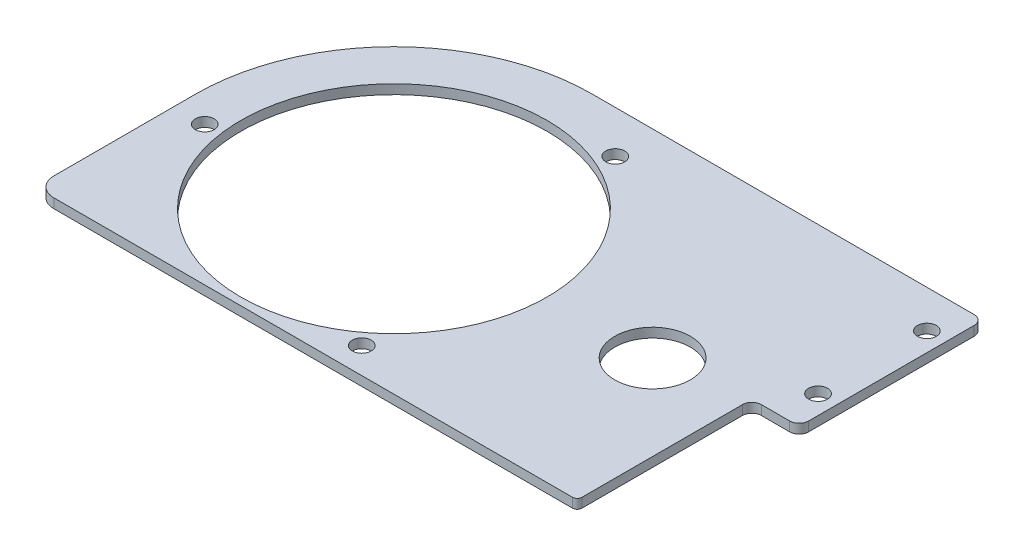
ISO-10303-21;
HEADER;
FILE_DESCRIPTION(('STEP AP214'),'2;1');
FILE_NAME('part.step','',(''),(''),'','','');
FILE_SCHEMA(('AUTOMOTIVE_DESIGN { 1 0 10303 214 1 1 1 1 }'));
ENDSEC;
DATA;
#1=APPLICATION_CONTEXT('core data for automotive mechanical design processes');
#2=APPLICATION_PROTOCOL_DEFINITION('international standard','automotive_design',2000,#1);
#3=PRODUCT_CONTEXT('',#1,'mechanical');
#4=PRODUCT('Part','Part','',(#3));
#5=PRODUCT_RELATED_PRODUCT_CATEGORY('part','',(#4));
#6=PRODUCT_DEFINITION_FORMATION('','',#4);
#7=PRODUCT_DEFINITION_CONTEXT('part definition',#1,'design');
#8=PRODUCT_DEFINITION('design','',#6,#7);
#9=PRODUCT_DEFINITION_SHAPE('','',#8);
#10=(LENGTH_UNIT() NAMED_UNIT(*) SI_UNIT(.MILLI.,.METRE.));
#11=(NAMED_UNIT(*) PLANE_ANGLE_UNIT() SI_UNIT($,.RADIAN.));
#12=(NAMED_UNIT(*) SI_UNIT($,.STERADIAN.) SOLID_ANGLE_UNIT());
#13=UNCERTAINTY_MEASURE_WITH_UNIT(LENGTH_MEASURE(1.E-05),#10,'distance_accuracy_value','');
#14=(GEOMETRIC_REPRESENTATION_CONTEXT(3) GLOBAL_UNCERTAINTY_ASSIGNED_CONTEXT((#13)) GLOBAL_UNIT_ASSIGNED_CONTEXT((#10,
#11,#12)) REPRESENTATION_CONTEXT('',''));
#15=CARTESIAN_POINT('',(0.,0.,0.));
#16=DIRECTION('',(0.,0.,1.));
#17=DIRECTION('',(1.,0.,0.));
#18=AXIS2_PLACEMENT_3D('',#15,#16,#17);
#19=CARTESIAN_POINT('',(-120.668920929197,6.35,95.2310790708027));
#20=DIRECTION('',(0.,-1.,0.));
#21=DIRECTION('',(0.,0.,-1.));
#22=AXIS2_PLACEMENT_3D('',#19,#20,#21);
#23=PLANE('',#22);
#24=CARTESIAN_POINT('',(-120.668920929197,6.35,95.2310790708027));
#25=DIRECTION('',(0.,1.,0.));
#26=DIRECTION('',(0.,0.,-1.));
#27=AXIS2_PLACEMENT_3D('',#24,#25,#26);
#28=CIRCLE('',#27,12.7);
#29=CARTESIAN_POINT('',(-133.368920929197,6.35,95.2310790708027));
#30=VERTEX_POINT('',#29);
#31=CARTESIAN_POINT('',(-120.668920929197,6.35,107.931079070803));
#32=VERTEX_POINT('',#31);
#33=EDGE_CURVE('E179',#30,#32,#28,.T.);
#34=ORIENTED_EDGE('',*,*,#33,.T.);
#35=DIRECTION('',(1.,0.,0.));
#36=VECTOR('',#35,1.);
#37=CARTESIAN_POINT('',(227.955539535401,6.35,107.931079070803));
#38=LINE('',#37,#36);
#39=CARTESIAN_POINT('',(227.955539535401,6.35,107.931079070803));
#40=VERTEX_POINT('',#39);
#41=EDGE_CURVE('E107',#32,#40,#38,.T.);
#42=ORIENTED_EDGE('',*,*,#41,.T.);
#43=CARTESIAN_POINT('',(227.955539535401,6.35,104.765539535401));
#44=DIRECTION('',(0.,1.,0.));
#45=DIRECTION('',(0.,0.,1.));
#46=AXIS2_PLACEMENT_3D('',#43,#44,#45);
#47=CIRCLE('',#46,3.16553953540139);
#48=CARTESIAN_POINT('',(231.121079070803,6.35,104.765539535401));
#49=VERTEX_POINT('',#48);
#50=EDGE_CURVE('E206',#40,#49,#47,.T.);
#51=ORIENTED_EDGE('',*,*,#50,.T.);
#52=DIRECTION('',(0.,0.,-1.));
#53=VECTOR('',#52,1.);
#54=CARTESIAN_POINT('',(231.121079070803,6.35,104.765539535401));
#55=LINE('',#54,#53);
#56=CARTESIAN_POINT('',(231.121079070803,6.35,-3.1007771089668));
#57=VERTEX_POINT('',#56);
#58=EDGE_CURVE('E225',#49,#57,#55,.T.);
#59=ORIENTED_EDGE('',*,*,#58,.T.);
#60=CARTESIAN_POINT('',(237.471079070803,6.35,-3.1007771089668));
#61=DIRECTION('',(0.,-1.,0.));
#62=DIRECTION('',(0.,0.,1.));
#63=AXIS2_PLACEMENT_3D('',#60,#61,#62);
#64=CIRCLE('',#63,6.35);
#65=CARTESIAN_POINT('',(237.471079070803,6.35,-9.4507771089668));
#66=VERTEX_POINT('',#65);
#67=EDGE_CURVE('E222',#57,#66,#64,.T.);
#68=ORIENTED_EDGE('',*,*,#67,.T.);
#69=DIRECTION('',(1.,0.,0.));
#70=VECTOR('',#69,1.);
#71=CARTESIAN_POINT('',(237.471079070803,6.35,-9.4507771089668));
#72=LINE('',#71,#70);
#73=CARTESIAN_POINT('',(256.521079070803,6.35,-9.4507771089668));
#74=VERTEX_POINT('',#73);
#75=EDGE_CURVE('E224',#66,#74,#72,.T.);
#76=ORIENTED_EDGE('',*,*,#75,.T.);
#77=CARTESIAN_POINT('',(256.521079070803,6.35,-15.8007771089668));
#78=DIRECTION('',(0.,1.,0.));
#79=DIRECTION('',(0.,0.,-1.));
#80=AXIS2_PLACEMENT_3D('',#77,#78,#79);
#81=CIRCLE('',#80,6.35000000000001);
#82=CARTESIAN_POINT('',(262.871079070803,6.35,-15.8007771089668));
#83=VERTEX_POINT('',#82);
#84=EDGE_CURVE('E227',#74,#83,#81,.T.);
#85=ORIENTED_EDGE('',*,*,#84,.T.);
#86=DIRECTION('',(0.,0.,-1.));
#87=VECTOR('',#86,1.);
#88=CARTESIAN_POINT('',(262.871079070803,6.35,-127.018920929198));
#89=LINE('',#88,#87);
#90=CARTESIAN_POINT('',(262.871079070803,6.35,-127.018920929198));
#91=VERTEX_POINT('',#90);
#92=EDGE_CURVE('E233',#83,#91,#89,.T.);
#93=ORIENTED_EDGE('',*,*,#92,.T.);
#94=CARTESIAN_POINT('',(256.521079070803,6.35,-127.018920929198));
#95=DIRECTION('',(0.,1.,0.));
#96=DIRECTION('',(0.,0.,-1.));
#97=AXIS2_PLACEMENT_3D('',#94,#95,#96);
#98=CIRCLE('',#97,6.34999999999997);
#99=CARTESIAN_POINT('',(256.521079070803,6.35,-133.368920929197));
#100=VERTEX_POINT('',#99);
#101=EDGE_CURVE('E138',#91,#100,#98,.T.);
#102=ORIENTED_EDGE('',*,*,#101,.T.);
#103=DIRECTION('',(-1.,0.,0.));
#104=VECTOR('',#103,1.);
#105=CARTESIAN_POINT('',(256.521079070803,6.35,-133.368920929197));
#106=LINE('',#105,#104);
#107=CARTESIAN_POINT('',(0.,6.35,-133.368920929197));
#108=VERTEX_POINT('',#107);
#109=EDGE_CURVE('E132',#100,#108,#106,.T.);
#110=ORIENTED_EDGE('',*,*,#109,.T.);
#111=CARTESIAN_POINT('',(0.,6.35,0.));
#112=DIRECTION('',(0.,1.,0.));
#113=DIRECTION('',(0.,0.,-1.));
#114=AXIS2_PLACEMENT_3D('',#111,#112,#113);
#115=CIRCLE('',#114,133.368920929197);
#116=CARTESIAN_POINT('',(-133.368920929197,6.35,0.));
#117=VERTEX_POINT('',#116);
#118=EDGE_CURVE('E136',#108,#117,#115,.T.);
#119=ORIENTED_EDGE('',*,*,#118,.T.);
#120=DIRECTION('',(0.,0.,1.));
#121=VECTOR('',#120,1.);
#122=CARTESIAN_POINT('',(-133.368920929197,6.35,0.));
#123=LINE('',#122,#121);
#124=EDGE_CURVE('E52',#117,#30,#123,.T.);
#125=ORIENTED_EDGE('',*,*,#124,.T.);
#126=EDGE_LOOP('',(#34,#42,#51,#59,#68,#76,#85,#93,#102,#110,#119,#125));
#127=FACE_BOUND('',#126,.T.);
#128=CARTESIAN_POINT('',(0.,6.35,0.));
#129=DIRECTION('',(0.,1.,0.));
#130=DIRECTION('',(0.,0.,1.));
#131=AXIS2_PLACEMENT_3D('',#128,#129,#130);
#132=CIRCLE('',#131,102.87);
#133=CARTESIAN_POINT('',(0.,6.35,102.87));
#134=VERTEX_POINT('',#133);
#135=EDGE_CURVE('E160',#134,#134,#132,.T.);
#136=ORIENTED_EDGE('',*,*,#135,.F.);
#137=EDGE_LOOP('',(#136));
#138=FACE_BOUND('',#137,.T.);
#139=CARTESIAN_POINT('',(-112.738641363336,6.35,14.3749635436919));
#140=DIRECTION('',(0.,1.,0.));
#141=DIRECTION('',(0.,0.,1.));
#142=AXIS2_PLACEMENT_3D('',#139,#140,#141);
#143=CIRCLE('',#142,6.34999999998776);
#144=CARTESIAN_POINT('',(-112.738641363336,6.35,20.7249635436796));
#145=VERTEX_POINT('',#144);
#146=EDGE_CURVE('E327',#145,#145,#143,.T.);
#147=ORIENTED_EDGE('',*,*,#146,.F.);
#148=EDGE_LOOP('',(#147));
#149=FACE_BOUND('',#148,.T.);
#150=CARTESIAN_POINT('',(250.171079070803,6.35,-107.968920929197));
#151=DIRECTION('',(0.,1.,0.));
#152=DIRECTION('',(0.,0.,1.));
#153=AXIS2_PLACEMENT_3D('',#150,#151,#152);
#154=CIRCLE('',#153,6.34999999999999);
#155=CARTESIAN_POINT('',(250.171079070803,6.35,-101.618920929198));
#156=VERTEX_POINT('',#155);
#157=EDGE_CURVE('E321',#156,#156,#154,.T.);
#158=ORIENTED_EDGE('',*,*,#157,.F.);
#159=EDGE_LOOP('',(#158));
#160=FACE_BOUND('',#159,.T.);
#161=CARTESIAN_POINT('',(250.171079070803,6.35,-34.8507771089668));
#162=DIRECTION('',(0.,1.,0.));
#163=DIRECTION('',(0.,0.,1.));
#164=AXIS2_PLACEMENT_3D('',#161,#162,#163);
#165=CIRCLE('',#164,6.34999999999993);
#166=CARTESIAN_POINT('',(250.171079070803,6.35,-28.5007771089669));
#167=VERTEX_POINT('',#166);
#168=EDGE_CURVE('E315',#167,#167,#165,.T.);
#169=ORIENTED_EDGE('',*,*,#168,.F.);
#170=EDGE_LOOP('',(#169));
#171=FACE_BOUND('',#170,.T.);
#172=CARTESIAN_POINT('',(43.9202370743555,6.35,-104.822009180638));
#173=DIRECTION('',(0.,1.,0.));
#174=DIRECTION('',(0.,0.,1.));
#175=AXIS2_PLACEMENT_3D('',#172,#173,#174);
#176=CIRCLE('',#175,6.35000000000721);
#177=CARTESIAN_POINT('',(43.9202370743555,6.35,-98.4720091806306));
#178=VERTEX_POINT('',#177);
#179=EDGE_CURVE('E309',#178,#178,#176,.T.);
#180=ORIENTED_EDGE('',*,*,#179,.F.);
#181=EDGE_LOOP('',(#180));
#182=FACE_BOUND('',#181,.T.);
#183=CARTESIAN_POINT('',(68.8184042889803,6.35,90.4470456369459));
#184=DIRECTION('',(0.,1.,0.));
#185=DIRECTION('',(0.,0.,1.));
#186=AXIS2_PLACEMENT_3D('',#183,#184,#185);
#187=CIRCLE('',#186,6.35000000000499);
#188=CARTESIAN_POINT('',(68.8184042889803,6.35,96.7970456369509));
#189=VERTEX_POINT('',#188);
#190=EDGE_CURVE('E302',#189,#189,#187,.T.);
#191=ORIENTED_EDGE('',*,*,#190,.F.);
#192=EDGE_LOOP('',(#191));
#193=FACE_BOUND('',#192,.T.);
#194=CARTESIAN_POINT('',(173.810939205606,6.35,0.));
#195=DIRECTION('',(0.,-1.,0.));
#196=DIRECTION('',(0.,0.,-1.));
#197=AXIS2_PLACEMENT_3D('',#194,#195,#196);
#198=CIRCLE('',#197,25.4);
#199=CARTESIAN_POINT('',(173.810939205606,6.35,-25.4));
#200=VERTEX_POINT('',#199);
#201=EDGE_CURVE('E297',#200,#200,#198,.F.);
#202=ORIENTED_EDGE('',*,*,#201,.F.);
#203=EDGE_LOOP('',(#202));
#204=FACE_BOUND('',#203,.T.);
#205=ADVANCED_FACE('F35',(#127,#138,#149,#160,#171,#182,#193,#204),#23,.F.);
#206=CARTESIAN_POINT('',(-120.668920929197,0.,95.2310790708027));
#207=DIRECTION('',(0.,-1.,0.));
#208=DIRECTION('',(0.,0.,-1.));
#209=AXIS2_PLACEMENT_3D('',#206,#207,#208);
#210=PLANE('',#209);
#211=CARTESIAN_POINT('',(68.8184042889803,0.,90.4470456369459));
#212=DIRECTION('',(0.,1.,0.));
#213=DIRECTION('',(0.,0.,1.));
#214=AXIS2_PLACEMENT_3D('',#211,#212,#213);
#215=CIRCLE('',#214,6.35000000000499);
#216=CARTESIAN_POINT('',(68.8184042889803,0.,96.7970456369509));
#217=VERTEX_POINT('',#216);
#218=EDGE_CURVE('E299',#217,#217,#215,.T.);
#219=ORIENTED_EDGE('',*,*,#218,.T.);
#220=EDGE_LOOP('',(#219));
#221=FACE_BOUND('',#220,.T.);
#222=CARTESIAN_POINT('',(250.171079070803,0.,-34.8507771089668));
#223=DIRECTION('',(0.,1.,0.));
#224=DIRECTION('',(0.,0.,1.));
#225=AXIS2_PLACEMENT_3D('',#222,#223,#224);
#226=CIRCLE('',#225,6.34999999999993);
#227=CARTESIAN_POINT('',(250.171079070803,0.,-28.5007771089669));
#228=VERTEX_POINT('',#227);
#229=EDGE_CURVE('E312',#228,#228,#226,.T.);
#230=ORIENTED_EDGE('',*,*,#229,.T.);
#231=EDGE_LOOP('',(#230));
#232=FACE_BOUND('',#231,.T.);
#233=CARTESIAN_POINT('',(-112.738641363336,0.,14.3749635436919));
#234=DIRECTION('',(0.,1.,0.));
#235=DIRECTION('',(0.,0.,1.));
#236=AXIS2_PLACEMENT_3D('',#233,#234,#235);
#237=CIRCLE('',#236,6.34999999998776);
#238=CARTESIAN_POINT('',(-112.738641363336,0.,20.7249635436796));
#239=VERTEX_POINT('',#238);
#240=EDGE_CURVE('E324',#239,#239,#237,.T.);
#241=ORIENTED_EDGE('',*,*,#240,.T.);
#242=EDGE_LOOP('',(#241));
#243=FACE_BOUND('',#242,.T.);
#244=CARTESIAN_POINT('',(-120.668920929197,0.,95.2310790708027));
#245=DIRECTION('',(0.,1.,0.));
#246=DIRECTION('',(0.,0.,-1.));
#247=AXIS2_PLACEMENT_3D('',#244,#245,#246);
#248=CIRCLE('',#247,12.7);
#249=CARTESIAN_POINT('',(-133.368920929197,0.,95.2310790708027));
#250=VERTEX_POINT('',#249);
#251=CARTESIAN_POINT('',(-120.668920929197,0.,107.931079070803));
#252=VERTEX_POINT('',#251);
#253=EDGE_CURVE('E156',#250,#252,#248,.T.);
#254=ORIENTED_EDGE('',*,*,#253,.F.);
#255=DIRECTION('',(0.,0.,1.));
#256=VECTOR('',#255,1.);
#257=CARTESIAN_POINT('',(-133.368920929197,0.,0.));
#258=LINE('',#257,#256);
#259=CARTESIAN_POINT('',(-133.368920929197,0.,0.));
#260=VERTEX_POINT('',#259);
#261=EDGE_CURVE('E99',#260,#250,#258,.T.);
#262=ORIENTED_EDGE('',*,*,#261,.F.);
#263=CARTESIAN_POINT('',(0.,0.,0.));
#264=DIRECTION('',(0.,1.,0.));
#265=DIRECTION('',(0.,0.,-1.));
#266=AXIS2_PLACEMENT_3D('',#263,#264,#265);
#267=CIRCLE('',#266,133.368920929197);
#268=CARTESIAN_POINT('',(0.,0.,-133.368920929197));
#269=VERTEX_POINT('',#268);
#270=EDGE_CURVE('E93',#269,#260,#267,.T.);
#271=ORIENTED_EDGE('',*,*,#270,.F.);
#272=DIRECTION('',(-1.,0.,0.));
#273=VECTOR('',#272,1.);
#274=CARTESIAN_POINT('',(256.521079070803,0.,-133.368920929197));
#275=LINE('',#274,#273);
#276=CARTESIAN_POINT('',(256.521079070803,0.,-133.368920929197));
#277=VERTEX_POINT('',#276);
#278=EDGE_CURVE('E146',#277,#269,#275,.T.);
#279=ORIENTED_EDGE('',*,*,#278,.F.);
#280=CARTESIAN_POINT('',(256.521079070803,0.,-127.018920929198));
#281=DIRECTION('',(0.,1.,0.));
#282=DIRECTION('',(0.,0.,-1.));
#283=AXIS2_PLACEMENT_3D('',#280,#281,#282);
#284=CIRCLE('',#283,6.34999999999997);
#285=CARTESIAN_POINT('',(262.871079070803,0.,-127.018920929198));
#286=VERTEX_POINT('',#285);
#287=EDGE_CURVE('E174',#286,#277,#284,.T.);
#288=ORIENTED_EDGE('',*,*,#287,.F.);
#289=DIRECTION('',(0.,0.,-1.));
#290=VECTOR('',#289,1.);
#291=CARTESIAN_POINT('',(262.871079070803,0.,-127.018920929198));
#292=LINE('',#291,#290);
#293=CARTESIAN_POINT('',(262.871079070803,0.,-15.8007771089668));
#294=VERTEX_POINT('',#293);
#295=EDGE_CURVE('E172',#294,#286,#292,.T.);
#296=ORIENTED_EDGE('',*,*,#295,.F.);
#297=CARTESIAN_POINT('',(256.521079070803,0.,-15.8007771089668));
#298=DIRECTION('',(0.,1.,0.));
#299=DIRECTION('',(0.,0.,-1.));
#300=AXIS2_PLACEMENT_3D('',#297,#298,#299);
#301=CIRCLE('',#300,6.35000000000001);
#302=CARTESIAN_POINT('',(256.521079070803,0.,-9.4507771089668));
#303=VERTEX_POINT('',#302);
#304=EDGE_CURVE('E170',#303,#294,#301,.T.);
#305=ORIENTED_EDGE('',*,*,#304,.F.);
#306=DIRECTION('',(1.,0.,0.));
#307=VECTOR('',#306,1.);
#308=CARTESIAN_POINT('',(237.471079070803,0.,-9.4507771089668));
#309=LINE('',#308,#307);
#310=CARTESIAN_POINT('',(237.471079070803,0.,-9.4507771089668));
#311=VERTEX_POINT('',#310);
#312=EDGE_CURVE('E168',#311,#303,#309,.T.);
#313=ORIENTED_EDGE('',*,*,#312,.F.);
#314=CARTESIAN_POINT('',(237.471079070803,0.,-3.1007771089668));
#315=DIRECTION('',(0.,-1.,0.));
#316=DIRECTION('',(0.,0.,1.));
#317=AXIS2_PLACEMENT_3D('',#314,#315,#316);
#318=CIRCLE('',#317,6.35);
#319=CARTESIAN_POINT('',(231.121079070803,0.,-3.1007771089668));
#320=VERTEX_POINT('',#319);
#321=EDGE_CURVE('E166',#320,#311,#318,.T.);
#322=ORIENTED_EDGE('',*,*,#321,.F.);
#323=DIRECTION('',(0.,0.,-1.));
#324=VECTOR('',#323,1.);
#325=CARTESIAN_POINT('',(231.121079070803,0.,104.765539535401));
#326=LINE('',#325,#324);
#327=CARTESIAN_POINT('',(231.121079070803,0.,104.765539535401));
#328=VERTEX_POINT('',#327);
#329=EDGE_CURVE('E164',#328,#320,#326,.T.);
#330=ORIENTED_EDGE('',*,*,#329,.F.);
#331=CARTESIAN_POINT('',(227.955539535401,0.,104.765539535401));
#332=DIRECTION('',(0.,1.,0.));
#333=DIRECTION('',(0.,0.,1.));
#334=AXIS2_PLACEMENT_3D('',#331,#332,#333);
#335=CIRCLE('',#334,3.16553953540139);
#336=CARTESIAN_POINT('',(227.955539535401,0.,107.931079070803));
#337=VERTEX_POINT('',#336);
#338=EDGE_CURVE('E162',#337,#328,#335,.T.);
#339=ORIENTED_EDGE('',*,*,#338,.F.);
#340=DIRECTION('',(1.,0.,0.));
#341=VECTOR('',#340,1.);
#342=CARTESIAN_POINT('',(227.955539535401,0.,107.931079070803));
#343=LINE('',#342,#341);
#344=EDGE_CURVE('E159',#252,#337,#343,.T.);
#345=ORIENTED_EDGE('',*,*,#344,.F.);
#346=EDGE_LOOP('',(#254,#262,#271,#279,#288,#296,#305,#313,#322,#330,#339,#345));
#347=FACE_BOUND('',#346,.T.);
#348=CARTESIAN_POINT('',(0.,0.,0.));
#349=DIRECTION('',(0.,1.,0.));
#350=DIRECTION('',(0.,0.,1.));
#351=AXIS2_PLACEMENT_3D('',#348,#349,#350);
#352=CIRCLE('',#351,102.87);
#353=CARTESIAN_POINT('',(0.,0.,102.87));
#354=VERTEX_POINT('',#353);
#355=EDGE_CURVE('E330',#354,#354,#352,.T.);
#356=ORIENTED_EDGE('',*,*,#355,.T.);
#357=EDGE_LOOP('',(#356));
#358=FACE_BOUND('',#357,.T.);
#359=CARTESIAN_POINT('',(250.171079070803,0.,-107.968920929197));
#360=DIRECTION('',(0.,1.,0.));
#361=DIRECTION('',(0.,0.,1.));
#362=AXIS2_PLACEMENT_3D('',#359,#360,#361);
#363=CIRCLE('',#362,6.34999999999999);
#364=CARTESIAN_POINT('',(250.171079070803,0.,-101.618920929198));
#365=VERTEX_POINT('',#364);
#366=EDGE_CURVE('E318',#365,#365,#363,.T.);
#367=ORIENTED_EDGE('',*,*,#366,.T.);
#368=EDGE_LOOP('',(#367));
#369=FACE_BOUND('',#368,.T.);
#370=CARTESIAN_POINT('',(43.9202370743555,0.,-104.822009180638));
#371=DIRECTION('',(0.,1.,0.));
#372=DIRECTION('',(0.,0.,1.));
#373=AXIS2_PLACEMENT_3D('',#370,#371,#372);
#374=CIRCLE('',#373,6.35000000000721);
#375=CARTESIAN_POINT('',(43.9202370743555,0.,-98.4720091806306));
#376=VERTEX_POINT('',#375);
#377=EDGE_CURVE('E307',#376,#376,#374,.T.);
#378=ORIENTED_EDGE('',*,*,#377,.T.);
#379=EDGE_LOOP('',(#378));
#380=FACE_BOUND('',#379,.T.);
#381=CARTESIAN_POINT('',(173.810939205606,0.,0.));
#382=DIRECTION('',(0.,1.,0.));
#383=DIRECTION('',(0.,0.,1.));
#384=AXIS2_PLACEMENT_3D('',#381,#382,#383);
#385=CIRCLE('',#384,25.4);
#386=CARTESIAN_POINT('',(173.810939205606,0.,25.4));
#387=VERTEX_POINT('',#386);
#388=EDGE_CURVE('E294',#387,#387,#385,.T.);
#389=ORIENTED_EDGE('',*,*,#388,.T.);
#390=EDGE_LOOP('',(#389));
#391=FACE_BOUND('',#390,.T.);
#392=ADVANCED_FACE('F210',(#221,#232,#243,#347,#358,#369,#380,#391),#210,.T.);
#393=CARTESIAN_POINT('',(-120.668920929197,6.35,95.2310790708027));
#394=DIRECTION('',(0.,-1.,0.));
#395=DIRECTION('',(0.,0.,-1.));
#396=AXIS2_PLACEMENT_3D('',#393,#394,#395);
#397=CYLINDRICAL_SURFACE('',#396,12.7);
#398=ORIENTED_EDGE('',*,*,#253,.T.);
#399=DIRECTION('',(0.,-1.,0.));
#400=VECTOR('',#399,1.);
#401=CARTESIAN_POINT('',(-120.668920929197,6.35,107.931079070803));
#402=LINE('',#401,#400);
#403=EDGE_CURVE('E11',#32,#252,#402,.T.);
#404=ORIENTED_EDGE('',*,*,#403,.F.);
#405=ORIENTED_EDGE('',*,*,#33,.F.);
#406=DIRECTION('',(0.,-1.,0.));
#407=VECTOR('',#406,1.);
#408=CARTESIAN_POINT('',(-133.368920929197,6.35,95.2310790708027));
#409=LINE('',#408,#407);
#410=EDGE_CURVE('E152',#30,#250,#409,.T.);
#411=ORIENTED_EDGE('',*,*,#410,.T.);
#412=EDGE_LOOP('',(#398,#404,#405,#411));
#413=FACE_BOUND('',#412,.T.);
#414=ADVANCED_FACE('F37',(#413),#397,.T.);
#415=CARTESIAN_POINT('',(227.955539535401,6.35,107.931079070803));
#416=DIRECTION('',(0.,0.,-1.));
#417=DIRECTION('',(-1.,0.,0.));
#418=AXIS2_PLACEMENT_3D('',#415,#416,#417);
#419=PLANE('',#418);
#420=ORIENTED_EDGE('',*,*,#344,.T.);
#421=DIRECTION('',(0.,-1.,0.));
#422=VECTOR('',#421,1.);
#423=CARTESIAN_POINT('',(227.955539535401,6.35,107.931079070803));
#424=LINE('',#423,#422);
#425=EDGE_CURVE('E44',#40,#337,#424,.T.);
#426=ORIENTED_EDGE('',*,*,#425,.F.);
#427=ORIENTED_EDGE('',*,*,#41,.F.);
#428=ORIENTED_EDGE('',*,*,#403,.T.);
#429=EDGE_LOOP('',(#420,#426,#427,#428));
#430=FACE_BOUND('',#429,.T.);
#431=ADVANCED_FACE('F471',(#430),#419,.F.);
#432=CARTESIAN_POINT('',(227.955539535401,6.35,104.765539535401));
#433=DIRECTION('',(0.,-1.,0.));
#434=DIRECTION('',(0.,0.,-1.));
#435=AXIS2_PLACEMENT_3D('',#432,#433,#434);
#436=CYLINDRICAL_SURFACE('',#435,3.16553953540139);
#437=ORIENTED_EDGE('',*,*,#338,.T.);
#438=DIRECTION('',(0.,-1.,0.));
#439=VECTOR('',#438,1.);
#440=CARTESIAN_POINT('',(231.121079070803,6.35,104.765539535401));
#441=LINE('',#440,#439);
#442=EDGE_CURVE('E198',#49,#328,#441,.T.);
#443=ORIENTED_EDGE('',*,*,#442,.F.);
#444=ORIENTED_EDGE('',*,*,#50,.F.);
#445=ORIENTED_EDGE('',*,*,#425,.T.);
#446=EDGE_LOOP('',(#437,#443,#444,#445));
#447=FACE_BOUND('',#446,.T.);
#448=ADVANCED_FACE('F204',(#447),#436,.T.);
#449=CARTESIAN_POINT('',(231.121079070803,6.35,104.765539535401));
#450=DIRECTION('',(-1.,0.,0.));
#451=DIRECTION('',(0.,0.,1.));
#452=AXIS2_PLACEMENT_3D('',#449,#450,#451);
#453=PLANE('',#452);
#454=ORIENTED_EDGE('',*,*,#329,.T.);
#455=DIRECTION('',(0.,-1.,0.));
#456=VECTOR('',#455,1.);
#457=CARTESIAN_POINT('',(231.121079070803,6.35,-3.1007771089668));
#458=LINE('',#457,#456);
#459=EDGE_CURVE('E195',#57,#320,#458,.T.);
#460=ORIENTED_EDGE('',*,*,#459,.F.);
#461=ORIENTED_EDGE('',*,*,#58,.F.);
#462=ORIENTED_EDGE('',*,*,#442,.T.);
#463=EDGE_LOOP('',(#454,#460,#461,#462));
#464=FACE_BOUND('',#463,.T.);
#465=ADVANCED_FACE('F216',(#464),#453,.F.);
#466=CARTESIAN_POINT('',(237.471079070803,6.35,-3.1007771089668));
#467=DIRECTION('',(0.,-1.,0.));
#468=DIRECTION('',(0.,0.,-1.));
#469=AXIS2_PLACEMENT_3D('',#466,#467,#468);
#470=CYLINDRICAL_SURFACE('',#469,6.35);
#471=ORIENTED_EDGE('',*,*,#321,.T.);
#472=DIRECTION('',(0.,-1.,0.));
#473=VECTOR('',#472,1.);
#474=CARTESIAN_POINT('',(237.471079070803,6.35,-9.4507771089668));
#475=LINE('',#474,#473);
#476=EDGE_CURVE('E192',#66,#311,#475,.T.);
#477=ORIENTED_EDGE('',*,*,#476,.F.);
#478=ORIENTED_EDGE('',*,*,#67,.F.);
#479=ORIENTED_EDGE('',*,*,#459,.T.);
#480=EDGE_LOOP('',(#471,#477,#478,#479));
#481=FACE_BOUND('',#480,.T.);
#482=ADVANCED_FACE('F220',(#481),#470,.F.);
#483=CARTESIAN_POINT('',(237.471079070803,6.35,-9.4507771089668));
#484=DIRECTION('',(0.,0.,-1.));
#485=DIRECTION('',(-1.,0.,0.));
#486=AXIS2_PLACEMENT_3D('',#483,#484,#485);
#487=PLANE('',#486);
#488=ORIENTED_EDGE('',*,*,#312,.T.);
#489=DIRECTION('',(0.,-1.,0.));
#490=VECTOR('',#489,1.);
#491=CARTESIAN_POINT('',(256.521079070803,6.35,-9.4507771089668));
#492=LINE('',#491,#490);
#493=EDGE_CURVE('E189',#74,#303,#492,.T.);
#494=ORIENTED_EDGE('',*,*,#493,.F.);
#495=ORIENTED_EDGE('',*,*,#75,.F.);
#496=ORIENTED_EDGE('',*,*,#476,.T.);
#497=EDGE_LOOP('',(#488,#494,#495,#496));
#498=FACE_BOUND('',#497,.T.);
#499=ADVANCED_FACE('F436',(#498),#487,.F.);
#500=CARTESIAN_POINT('',(256.521079070803,6.35,-15.8007771089668));
#501=DIRECTION('',(0.,-1.,0.));
#502=DIRECTION('',(0.,0.,-1.));
#503=AXIS2_PLACEMENT_3D('',#500,#501,#502);
#504=CYLINDRICAL_SURFACE('',#503,6.35000000000001);
#505=ORIENTED_EDGE('',*,*,#304,.T.);
#506=DIRECTION('',(0.,-1.,0.));
#507=VECTOR('',#506,1.);
#508=CARTESIAN_POINT('',(262.871079070803,6.35,-15.8007771089668));
#509=LINE('',#508,#507);
#510=EDGE_CURVE('E186',#83,#294,#509,.T.);
#511=ORIENTED_EDGE('',*,*,#510,.F.);
#512=ORIENTED_EDGE('',*,*,#84,.F.);
#513=ORIENTED_EDGE('',*,*,#493,.T.);
#514=EDGE_LOOP('',(#505,#511,#512,#513));
#515=FACE_BOUND('',#514,.T.);
#516=ADVANCED_FACE('F427',(#515),#504,.T.);
#517=CARTESIAN_POINT('',(262.871079070803,6.35,-127.018920929198));
#518=DIRECTION('',(-1.,0.,0.));
#519=DIRECTION('',(0.,0.,1.));
#520=AXIS2_PLACEMENT_3D('',#517,#518,#519);
#521=PLANE('',#520);
#522=ORIENTED_EDGE('',*,*,#295,.T.);
#523=DIRECTION('',(0.,-1.,0.));
#524=VECTOR('',#523,1.);
#525=CARTESIAN_POINT('',(262.871079070803,6.35,-127.018920929198));
#526=LINE('',#525,#524);
#527=EDGE_CURVE('E183',#91,#286,#526,.T.);
#528=ORIENTED_EDGE('',*,*,#527,.F.);
#529=ORIENTED_EDGE('',*,*,#92,.F.);
#530=ORIENTED_EDGE('',*,*,#510,.T.);
#531=EDGE_LOOP('',(#522,#528,#529,#530));
#532=FACE_BOUND('',#531,.T.);
#533=ADVANCED_FACE('F239',(#532),#521,.F.);
#534=CARTESIAN_POINT('',(256.521079070803,6.35,-127.018920929198));
#535=DIRECTION('',(0.,-1.,0.));
#536=DIRECTION('',(0.,0.,-1.));
#537=AXIS2_PLACEMENT_3D('',#534,#535,#536);
#538=CYLINDRICAL_SURFACE('',#537,6.34999999999997);
#539=ORIENTED_EDGE('',*,*,#287,.T.);
#540=DIRECTION('',(0.,-1.,0.));
#541=VECTOR('',#540,1.);
#542=CARTESIAN_POINT('',(256.521079070803,6.35,-133.368920929197));
#543=LINE('',#542,#541);
#544=EDGE_CURVE('E147',#100,#277,#543,.T.);
#545=ORIENTED_EDGE('',*,*,#544,.F.);
#546=ORIENTED_EDGE('',*,*,#101,.F.);
#547=ORIENTED_EDGE('',*,*,#527,.T.);
#548=EDGE_LOOP('',(#539,#545,#546,#547));
#549=FACE_BOUND('',#548,.T.);
#550=ADVANCED_FACE('F243',(#549),#538,.T.);
#551=CARTESIAN_POINT('',(256.521079070803,6.35,-133.368920929197));
#552=DIRECTION('',(0.,0.,1.));
#553=DIRECTION('',(1.,0.,0.));
#554=AXIS2_PLACEMENT_3D('',#551,#552,#553);
#555=PLANE('',#554);
#556=ORIENTED_EDGE('',*,*,#278,.T.);
#557=DIRECTION('',(0.,-1.,0.));
#558=VECTOR('',#557,1.);
#559=CARTESIAN_POINT('',(0.,6.35,-133.368920929197));
#560=LINE('',#559,#558);
#561=EDGE_CURVE('E143',#108,#269,#560,.T.);
#562=ORIENTED_EDGE('',*,*,#561,.F.);
#563=ORIENTED_EDGE('',*,*,#109,.F.);
#564=ORIENTED_EDGE('',*,*,#544,.T.);
#565=EDGE_LOOP('',(#556,#562,#563,#564));
#566=FACE_BOUND('',#565,.T.);
#567=ADVANCED_FACE('F144',(#566),#555,.F.);
#568=CARTESIAN_POINT('',(0.,6.35,0.));
#569=DIRECTION('',(0.,-1.,0.));
#570=DIRECTION('',(0.,0.,-1.));
#571=AXIS2_PLACEMENT_3D('',#568,#569,#570);
#572=CYLINDRICAL_SURFACE('',#571,133.368920929197);
#573=ORIENTED_EDGE('',*,*,#270,.T.);
#574=DIRECTION('',(0.,-1.,0.));
#575=VECTOR('',#574,1.);
#576=CARTESIAN_POINT('',(-133.368920929197,6.35,0.));
#577=LINE('',#576,#575);
#578=EDGE_CURVE('E148',#117,#260,#577,.T.);
#579=ORIENTED_EDGE('',*,*,#578,.F.);
#580=ORIENTED_EDGE('',*,*,#118,.F.);
#581=ORIENTED_EDGE('',*,*,#561,.T.);
#582=EDGE_LOOP('',(#573,#579,#580,#581));
#583=FACE_BOUND('',#582,.T.);
#584=ADVANCED_FACE('F150',(#583),#572,.T.);
#585=CARTESIAN_POINT('',(-133.368920929197,6.35,0.));
#586=DIRECTION('',(1.,0.,0.));
#587=DIRECTION('',(0.,0.,-1.));
#588=AXIS2_PLACEMENT_3D('',#585,#586,#587);
#589=PLANE('',#588);
#590=ORIENTED_EDGE('',*,*,#261,.T.);
#591=ORIENTED_EDGE('',*,*,#410,.F.);
#592=ORIENTED_EDGE('',*,*,#124,.F.);
#593=ORIENTED_EDGE('',*,*,#578,.T.);
#594=EDGE_LOOP('',(#590,#591,#592,#593));
#595=FACE_BOUND('',#594,.T.);
#596=ADVANCED_FACE('F247',(#595),#589,.F.);
#597=CARTESIAN_POINT('',(0.,6.35,0.));
#598=DIRECTION('',(0.,-1.,0.));
#599=DIRECTION('',(0.,0.,-1.));
#600=AXIS2_PLACEMENT_3D('',#597,#598,#599);
#601=CYLINDRICAL_SURFACE('',#600,102.87);
#602=ORIENTED_EDGE('',*,*,#135,.T.);
#603=EDGE_LOOP('',(#602));
#604=FACE_BOUND('',#603,.T.);
#605=ORIENTED_EDGE('',*,*,#355,.F.);
#606=EDGE_LOOP('',(#605));
#607=FACE_BOUND('',#606,.T.);
#608=ADVANCED_FACE('F249',(#604,#607),#601,.F.);
#609=CARTESIAN_POINT('',(-112.738641363336,6.35,14.3749635436919));
#610=DIRECTION('',(0.,-1.,0.));
#611=DIRECTION('',(0.,0.,-1.));
#612=AXIS2_PLACEMENT_3D('',#609,#610,#611);
#613=CYLINDRICAL_SURFACE('',#612,6.34999999998776);
#614=ORIENTED_EDGE('',*,*,#146,.T.);
#615=EDGE_LOOP('',(#614));
#616=FACE_BOUND('',#615,.T.);
#617=ORIENTED_EDGE('',*,*,#240,.F.);
#618=EDGE_LOOP('',(#617));
#619=FACE_BOUND('',#618,.T.);
#620=ADVANCED_FACE('F255',(#616,#619),#613,.F.);
#621=CARTESIAN_POINT('',(250.171079070803,6.35,-107.968920929197));
#622=DIRECTION('',(0.,-1.,0.));
#623=DIRECTION('',(0.,0.,-1.));
#624=AXIS2_PLACEMENT_3D('',#621,#622,#623);
#625=CYLINDRICAL_SURFACE('',#624,6.34999999999999);
#626=ORIENTED_EDGE('',*,*,#157,.T.);
#627=EDGE_LOOP('',(#626));
#628=FACE_BOUND('',#627,.T.);
#629=ORIENTED_EDGE('',*,*,#366,.F.);
#630=EDGE_LOOP('',(#629));
#631=FACE_BOUND('',#630,.T.);
#632=ADVANCED_FACE('F269',(#628,#631),#625,.F.);
#633=CARTESIAN_POINT('',(250.171079070803,6.35,-34.8507771089668));
#634=DIRECTION('',(0.,-1.,0.));
#635=DIRECTION('',(0.,0.,-1.));
#636=AXIS2_PLACEMENT_3D('',#633,#634,#635);
#637=CYLINDRICAL_SURFACE('',#636,6.34999999999993);
#638=ORIENTED_EDGE('',*,*,#168,.T.);
#639=EDGE_LOOP('',(#638));
#640=FACE_BOUND('',#639,.T.);
#641=ORIENTED_EDGE('',*,*,#229,.F.);
#642=EDGE_LOOP('',(#641));
#643=FACE_BOUND('',#642,.T.);
#644=ADVANCED_FACE('F273',(#640,#643),#637,.F.);
#645=CARTESIAN_POINT('',(43.9202370743555,6.35,-104.822009180638));
#646=DIRECTION('',(0.,-1.,0.));
#647=DIRECTION('',(0.,0.,-1.));
#648=AXIS2_PLACEMENT_3D('',#645,#646,#647);
#649=CYLINDRICAL_SURFACE('',#648,6.35000000000721);
#650=ORIENTED_EDGE('',*,*,#179,.T.);
#651=EDGE_LOOP('',(#650));
#652=FACE_BOUND('',#651,.T.);
#653=ORIENTED_EDGE('',*,*,#377,.F.);
#654=EDGE_LOOP('',(#653));
#655=FACE_BOUND('',#654,.T.);
#656=ADVANCED_FACE('F277',(#652,#655),#649,.F.);
#657=CARTESIAN_POINT('',(68.8184042889803,6.35,90.4470456369459));
#658=DIRECTION('',(0.,-1.,0.));
#659=DIRECTION('',(0.,0.,-1.));
#660=AXIS2_PLACEMENT_3D('',#657,#658,#659);
#661=CYLINDRICAL_SURFACE('',#660,6.35000000000499);
#662=ORIENTED_EDGE('',*,*,#190,.T.);
#663=EDGE_LOOP('',(#662));
#664=FACE_BOUND('',#663,.T.);
#665=ORIENTED_EDGE('',*,*,#218,.F.);
#666=EDGE_LOOP('',(#665));
#667=FACE_BOUND('',#666,.T.);
#668=ADVANCED_FACE('F281',(#664,#667),#661,.F.);
#669=CARTESIAN_POINT('',(173.810939205606,28.448,0.));
#670=DIRECTION('',(0.,-1.,0.));
#671=DIRECTION('',(0.,0.,-1.));
#672=AXIS2_PLACEMENT_3D('',#669,#670,#671);
#673=CYLINDRICAL_SURFACE('',#672,25.4);
#674=ORIENTED_EDGE('',*,*,#388,.F.);
#675=EDGE_LOOP('',(#674));
#676=FACE_BOUND('',#675,.T.);
#677=ORIENTED_EDGE('',*,*,#201,.T.);
#678=EDGE_LOOP('',(#677));
#679=FACE_BOUND('',#678,.T.);
#680=ADVANCED_FACE('F285',(#676,#679),#673,.F.);
#681=CLOSED_SHELL('',(#205,#392,#414,#431,#448,#465,#482,#499,#516,#533,#550,#567,#584,#596,
#608,#620,#632,#644,#656,#668,#680));
#682=MANIFOLD_SOLID_BREP('B2',#681);
#683=ADVANCED_BREP_SHAPE_REPRESENTATION('',(#18,#682),#14);
#684=SHAPE_DEFINITION_REPRESENTATION(#9,#683);
ENDSEC;
END-ISO-10303-21;
